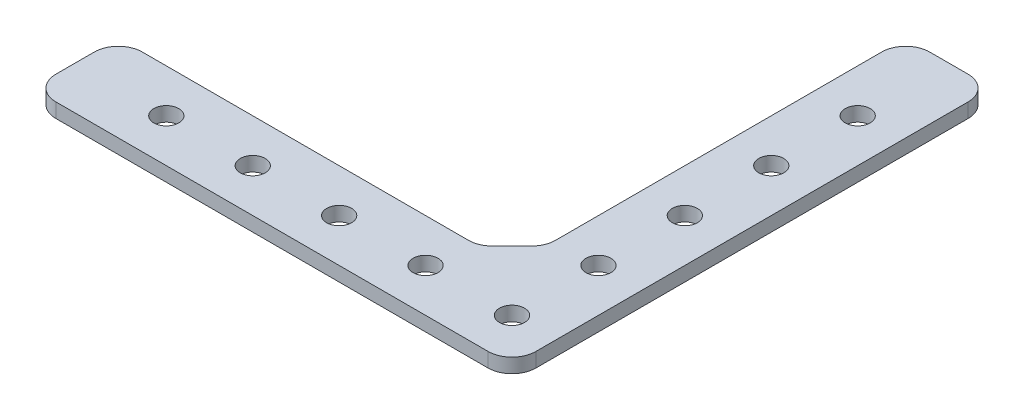
ISO-10303-21;
HEADER;
FILE_DESCRIPTION(('STEP AP214'),'2;1');
FILE_NAME('part.step','',(''),(''),'','','');
FILE_SCHEMA(('AUTOMOTIVE_DESIGN { 1 0 10303 214 1 1 1 1 }'));
ENDSEC;
DATA;
#1=APPLICATION_CONTEXT('core data for automotive mechanical design processes');
#2=APPLICATION_PROTOCOL_DEFINITION('international standard','automotive_design',2000,#1);
#3=PRODUCT_CONTEXT('',#1,'mechanical');
#4=PRODUCT('Part','Part','',(#3));
#5=PRODUCT_RELATED_PRODUCT_CATEGORY('part','',(#4));
#6=PRODUCT_DEFINITION_FORMATION('','',#4);
#7=PRODUCT_DEFINITION_CONTEXT('part definition',#1,'design');
#8=PRODUCT_DEFINITION('design','',#6,#7);
#9=PRODUCT_DEFINITION_SHAPE('','',#8);
#10=(LENGTH_UNIT() NAMED_UNIT(*) SI_UNIT(.MILLI.,.METRE.));
#11=(NAMED_UNIT(*) PLANE_ANGLE_UNIT() SI_UNIT($,.RADIAN.));
#12=(NAMED_UNIT(*) SI_UNIT($,.STERADIAN.) SOLID_ANGLE_UNIT());
#13=UNCERTAINTY_MEASURE_WITH_UNIT(LENGTH_MEASURE(1.E-05),#10,'distance_accuracy_value','');
#14=(GEOMETRIC_REPRESENTATION_CONTEXT(3) GLOBAL_UNCERTAINTY_ASSIGNED_CONTEXT((#13)) GLOBAL_UNIT_ASSIGNED_CONTEXT((#10,
#11,#12)) REPRESENTATION_CONTEXT('',''));
#15=CARTESIAN_POINT('',(0.,0.,0.));
#16=DIRECTION('',(0.,0.,1.));
#17=DIRECTION('',(1.,0.,0.));
#18=AXIS2_PLACEMENT_3D('',#15,#16,#17);
#19=CARTESIAN_POINT('',(50.,-3.,-50.));
#20=DIRECTION('',(1.,0.,0.));
#21=DIRECTION('',(0.,0.,-1.));
#22=AXIS2_PLACEMENT_3D('',#19,#20,#21);
#23=PLANE('',#22);
#24=DIRECTION('',(0.,0.,-1.));
#25=VECTOR('',#24,1.);
#26=CARTESIAN_POINT('',(50.,-3.,-50.));
#27=LINE('',#26,#25);
#28=CARTESIAN_POINT('',(50.,-3.,45.));
#29=VERTEX_POINT('',#28);
#30=CARTESIAN_POINT('',(50.,-3.,-45.));
#31=VERTEX_POINT('',#30);
#32=EDGE_CURVE('E243',#29,#31,#27,.T.);
#33=ORIENTED_EDGE('',*,*,#32,.T.);
#34=DIRECTION('',(0.,1.,0.));
#35=VECTOR('',#34,1.);
#36=CARTESIAN_POINT('',(50.,-3.,-45.));
#37=LINE('',#36,#35);
#38=CARTESIAN_POINT('',(50.,0.,-45.));
#39=VERTEX_POINT('',#38);
#40=EDGE_CURVE('E222',#31,#39,#37,.T.);
#41=ORIENTED_EDGE('',*,*,#40,.T.);
#42=DIRECTION('',(0.,0.,-1.));
#43=VECTOR('',#42,1.);
#44=CARTESIAN_POINT('',(50.,0.,-50.));
#45=LINE('',#44,#43);
#46=CARTESIAN_POINT('',(50.,0.,45.));
#47=VERTEX_POINT('',#46);
#48=EDGE_CURVE('E248',#47,#39,#45,.T.);
#49=ORIENTED_EDGE('',*,*,#48,.F.);
#50=DIRECTION('',(0.,1.,0.));
#51=VECTOR('',#50,1.);
#52=CARTESIAN_POINT('',(50.,-3.,45.));
#53=LINE('',#52,#51);
#54=EDGE_CURVE('E220',#47,#29,#53,.F.);
#55=ORIENTED_EDGE('',*,*,#54,.T.);
#56=EDGE_LOOP('',(#33,#41,#49,#55));
#57=FACE_BOUND('',#56,.T.);
#58=ADVANCED_FACE('F39',(#57),#23,.T.);
#59=CARTESIAN_POINT('',(-50.,-3.,50.));
#60=DIRECTION('',(0.,0.,1.));
#61=DIRECTION('',(1.,0.,0.));
#62=AXIS2_PLACEMENT_3D('',#59,#60,#61);
#63=PLANE('',#62);
#64=DIRECTION('',(1.,0.,0.));
#65=VECTOR('',#64,1.);
#66=CARTESIAN_POINT('',(-50.,-3.,50.));
#67=LINE('',#66,#65);
#68=CARTESIAN_POINT('',(-45.,-3.,50.));
#69=VERTEX_POINT('',#68);
#70=CARTESIAN_POINT('',(45.,-3.,50.));
#71=VERTEX_POINT('',#70);
#72=EDGE_CURVE('E170',#69,#71,#67,.T.);
#73=ORIENTED_EDGE('',*,*,#72,.T.);
#74=DIRECTION('',(0.,1.,0.));
#75=VECTOR('',#74,1.);
#76=CARTESIAN_POINT('',(45.,-3.,50.));
#77=LINE('',#76,#75);
#78=CARTESIAN_POINT('',(45.,0.,50.));
#79=VERTEX_POINT('',#78);
#80=EDGE_CURVE('E11',#71,#79,#77,.T.);
#81=ORIENTED_EDGE('',*,*,#80,.T.);
#82=DIRECTION('',(1.,0.,0.));
#83=VECTOR('',#82,1.);
#84=CARTESIAN_POINT('',(-50.,0.,50.));
#85=LINE('',#84,#83);
#86=CARTESIAN_POINT('',(-45.,0.,50.));
#87=VERTEX_POINT('',#86);
#88=EDGE_CURVE('E178',#87,#79,#85,.T.);
#89=ORIENTED_EDGE('',*,*,#88,.F.);
#90=DIRECTION('',(0.,1.,0.));
#91=VECTOR('',#90,1.);
#92=CARTESIAN_POINT('',(-45.,-3.,50.));
#93=LINE('',#92,#91);
#94=EDGE_CURVE('E47',#87,#69,#93,.F.);
#95=ORIENTED_EDGE('',*,*,#94,.T.);
#96=EDGE_LOOP('',(#73,#81,#89,#95));
#97=FACE_BOUND('',#96,.T.);
#98=ADVANCED_FACE('F227',(#97),#63,.T.);
#99=CARTESIAN_POINT('',(-49.9999999999999,-3.,32.));
#100=DIRECTION('',(-1.,0.,0.));
#101=DIRECTION('',(0.,0.,1.));
#102=AXIS2_PLACEMENT_3D('',#99,#100,#101);
#103=PLANE('',#102);
#104=DIRECTION('',(0.,0.,1.));
#105=VECTOR('',#104,1.);
#106=CARTESIAN_POINT('',(-49.9999999999999,0.,32.));
#107=LINE('',#106,#105);
#108=CARTESIAN_POINT('',(-49.9999999999999,0.,37.));
#109=VERTEX_POINT('',#108);
#110=CARTESIAN_POINT('',(-50.,0.,45.));
#111=VERTEX_POINT('',#110);
#112=EDGE_CURVE('E239',#109,#111,#107,.T.);
#113=ORIENTED_EDGE('',*,*,#112,.F.);
#114=DIRECTION('',(0.,1.,0.));
#115=VECTOR('',#114,1.);
#116=CARTESIAN_POINT('',(-49.9999999999999,-3.,37.));
#117=LINE('',#116,#115);
#118=CARTESIAN_POINT('',(-49.9999999999999,-3.,37.));
#119=VERTEX_POINT('',#118);
#120=EDGE_CURVE('E218',#109,#119,#117,.F.);
#121=ORIENTED_EDGE('',*,*,#120,.T.);
#122=DIRECTION('',(0.,0.,1.));
#123=VECTOR('',#122,1.);
#124=CARTESIAN_POINT('',(-49.9999999999999,-3.,32.));
#125=LINE('',#124,#123);
#126=CARTESIAN_POINT('',(-50.,-3.,45.));
#127=VERTEX_POINT('',#126);
#128=EDGE_CURVE('E175',#119,#127,#125,.T.);
#129=ORIENTED_EDGE('',*,*,#128,.T.);
#130=DIRECTION('',(0.,1.,0.));
#131=VECTOR('',#130,1.);
#132=CARTESIAN_POINT('',(-50.,-3.,45.));
#133=LINE('',#132,#131);
#134=EDGE_CURVE('E215',#127,#111,#133,.T.);
#135=ORIENTED_EDGE('',*,*,#134,.T.);
#136=EDGE_LOOP('',(#113,#121,#129,#135));
#137=FACE_BOUND('',#136,.T.);
#138=ADVANCED_FACE('F238',(#137),#103,.T.);
#139=CARTESIAN_POINT('',(24.9999999999999,-3.,32.));
#140=DIRECTION('',(0.,0.,-1.));
#141=DIRECTION('',(-1.,0.,0.));
#142=AXIS2_PLACEMENT_3D('',#139,#140,#141);
#143=PLANE('',#142);
#144=DIRECTION('',(-1.,0.,0.));
#145=VECTOR('',#144,1.);
#146=CARTESIAN_POINT('',(24.9999999999999,-3.,32.));
#147=LINE('',#146,#145);
#148=CARTESIAN_POINT('',(22.9289321881343,-3.,32.));
#149=VERTEX_POINT('',#148);
#150=CARTESIAN_POINT('',(-44.9999999999999,-3.,32.));
#151=VERTEX_POINT('',#150);
#152=EDGE_CURVE('E253',#149,#151,#147,.T.);
#153=ORIENTED_EDGE('',*,*,#152,.T.);
#154=DIRECTION('',(0.,1.,0.));
#155=VECTOR('',#154,1.);
#156=CARTESIAN_POINT('',(-44.9999999999999,-3.,32.));
#157=LINE('',#156,#155);
#158=CARTESIAN_POINT('',(-44.9999999999999,0.,32.));
#159=VERTEX_POINT('',#158);
#160=EDGE_CURVE('E212',#151,#159,#157,.T.);
#161=ORIENTED_EDGE('',*,*,#160,.T.);
#162=DIRECTION('',(-1.,0.,0.));
#163=VECTOR('',#162,1.);
#164=CARTESIAN_POINT('',(24.9999999999999,0.,32.));
#165=LINE('',#164,#163);
#166=CARTESIAN_POINT('',(22.9289321881343,0.,32.));
#167=VERTEX_POINT('',#166);
#168=EDGE_CURVE('E242',#167,#159,#165,.T.);
#169=ORIENTED_EDGE('',*,*,#168,.F.);
#170=DIRECTION('',(0.,1.,0.));
#171=VECTOR('',#170,1.);
#172=CARTESIAN_POINT('',(22.9289321881343,-3.,32.));
#173=LINE('',#172,#171);
#174=EDGE_CURVE('E163',#167,#149,#173,.F.);
#175=ORIENTED_EDGE('',*,*,#174,.T.);
#176=EDGE_LOOP('',(#153,#161,#169,#175));
#177=FACE_BOUND('',#176,.T.);
#178=ADVANCED_FACE('F411',(#177),#143,.T.);
#179=CARTESIAN_POINT('',(31.9999999999998,-3.,24.9999999999997));
#180=DIRECTION('',(-0.707106781186566,0.,-0.707106781186529));
#181=DIRECTION('',(-0.707106781186529,0.,0.707106781186566));
#182=AXIS2_PLACEMENT_3D('',#179,#180,#181);
#183=PLANE('',#182);
#184=DIRECTION('',(-0.707106781186529,0.,0.707106781186566));
#185=VECTOR('',#184,1.);
#186=CARTESIAN_POINT('',(31.9999999999998,0.,24.9999999999997));
#187=LINE('',#186,#185);
#188=CARTESIAN_POINT('',(30.5355339059326,0.,26.464466094067));
#189=VERTEX_POINT('',#188);
#190=CARTESIAN_POINT('',(26.4644660940671,0.,30.5355339059327));
#191=VERTEX_POINT('',#190);
#192=EDGE_CURVE('E152',#189,#191,#187,.T.);
#193=ORIENTED_EDGE('',*,*,#192,.F.);
#194=DIRECTION('',(0.,1.,0.));
#195=VECTOR('',#194,1.);
#196=CARTESIAN_POINT('',(30.5355339059326,-3.,26.464466094067));
#197=LINE('',#196,#195);
#198=CARTESIAN_POINT('',(30.5355339059326,-3.,26.464466094067));
#199=VERTEX_POINT('',#198);
#200=EDGE_CURVE('E161',#189,#199,#197,.F.);
#201=ORIENTED_EDGE('',*,*,#200,.T.);
#202=DIRECTION('',(-0.707106781186529,0.,0.707106781186566));
#203=VECTOR('',#202,1.);
#204=CARTESIAN_POINT('',(31.9999999999998,-3.,24.9999999999997));
#205=LINE('',#204,#203);
#206=CARTESIAN_POINT('',(26.4644660940671,-3.,30.5355339059327));
#207=VERTEX_POINT('',#206);
#208=EDGE_CURVE('E255',#199,#207,#205,.T.);
#209=ORIENTED_EDGE('',*,*,#208,.T.);
#210=DIRECTION('',(0.,1.,0.));
#211=VECTOR('',#210,1.);
#212=CARTESIAN_POINT('',(26.4644660940671,0.,30.5355339059327));
#213=LINE('',#212,#211);
#214=EDGE_CURVE('E169',#207,#191,#213,.T.);
#215=ORIENTED_EDGE('',*,*,#214,.T.);
#216=EDGE_LOOP('',(#193,#201,#209,#215));
#217=FACE_BOUND('',#216,.T.);
#218=ADVANCED_FACE('F407',(#217),#183,.T.);
#219=CARTESIAN_POINT('',(32.,-3.,-50.));
#220=DIRECTION('',(-1.,0.,0.));
#221=DIRECTION('',(0.,0.,1.));
#222=AXIS2_PLACEMENT_3D('',#219,#220,#221);
#223=PLANE('',#222);
#224=DIRECTION('',(0.,0.,1.));
#225=VECTOR('',#224,1.);
#226=CARTESIAN_POINT('',(32.,0.,-50.));
#227=LINE('',#226,#225);
#228=CARTESIAN_POINT('',(32.,0.,-45.));
#229=VERTEX_POINT('',#228);
#230=CARTESIAN_POINT('',(31.9999999999998,0.,22.9289321881344));
#231=VERTEX_POINT('',#230);
#232=EDGE_CURVE('E141',#229,#231,#227,.T.);
#233=ORIENTED_EDGE('',*,*,#232,.F.);
#234=DIRECTION('',(0.,1.,0.));
#235=VECTOR('',#234,1.);
#236=CARTESIAN_POINT('',(32.,-3.,-45.));
#237=LINE('',#236,#235);
#238=CARTESIAN_POINT('',(32.,-3.,-45.));
#239=VERTEX_POINT('',#238);
#240=EDGE_CURVE('E202',#229,#239,#237,.F.);
#241=ORIENTED_EDGE('',*,*,#240,.T.);
#242=DIRECTION('',(0.,0.,1.));
#243=VECTOR('',#242,1.);
#244=CARTESIAN_POINT('',(32.,-3.,-50.));
#245=LINE('',#244,#243);
#246=CARTESIAN_POINT('',(31.9999999999998,-3.,22.9289321881344));
#247=VERTEX_POINT('',#246);
#248=EDGE_CURVE('E167',#239,#247,#245,.T.);
#249=ORIENTED_EDGE('',*,*,#248,.T.);
#250=DIRECTION('',(0.,1.,0.));
#251=VECTOR('',#250,1.);
#252=CARTESIAN_POINT('',(31.9999999999998,0.,22.9289321881344));
#253=LINE('',#252,#251);
#254=EDGE_CURVE('E160',#247,#231,#253,.T.);
#255=ORIENTED_EDGE('',*,*,#254,.T.);
#256=EDGE_LOOP('',(#233,#241,#249,#255));
#257=FACE_BOUND('',#256,.T.);
#258=ADVANCED_FACE('F165',(#257),#223,.T.);
#259=CARTESIAN_POINT('',(32.,-3.,-50.));
#260=DIRECTION('',(0.,0.,-1.));
#261=DIRECTION('',(-1.,0.,0.));
#262=AXIS2_PLACEMENT_3D('',#259,#260,#261);
#263=PLANE('',#262);
#264=DIRECTION('',(-1.,0.,0.));
#265=VECTOR('',#264,1.);
#266=CARTESIAN_POINT('',(32.,-3.,-50.));
#267=LINE('',#266,#265);
#268=CARTESIAN_POINT('',(45.,-3.,-50.));
#269=VERTEX_POINT('',#268);
#270=CARTESIAN_POINT('',(37.,-3.,-50.));
#271=VERTEX_POINT('',#270);
#272=EDGE_CURVE('E259',#269,#271,#267,.T.);
#273=ORIENTED_EDGE('',*,*,#272,.T.);
#274=DIRECTION('',(0.,1.,0.));
#275=VECTOR('',#274,1.);
#276=CARTESIAN_POINT('',(37.,-3.,-50.));
#277=LINE('',#276,#275);
#278=CARTESIAN_POINT('',(37.,0.,-50.));
#279=VERTEX_POINT('',#278);
#280=EDGE_CURVE('E190',#271,#279,#277,.T.);
#281=ORIENTED_EDGE('',*,*,#280,.T.);
#282=DIRECTION('',(-1.,0.,0.));
#283=VECTOR('',#282,1.);
#284=CARTESIAN_POINT('',(32.,0.,-50.));
#285=LINE('',#284,#283);
#286=CARTESIAN_POINT('',(45.,0.,-50.));
#287=VERTEX_POINT('',#286);
#288=EDGE_CURVE('E153',#287,#279,#285,.T.);
#289=ORIENTED_EDGE('',*,*,#288,.F.);
#290=DIRECTION('',(0.,1.,0.));
#291=VECTOR('',#290,1.);
#292=CARTESIAN_POINT('',(45.,-3.,-50.));
#293=LINE('',#292,#291);
#294=EDGE_CURVE('E188',#287,#269,#293,.F.);
#295=ORIENTED_EDGE('',*,*,#294,.T.);
#296=EDGE_LOOP('',(#273,#281,#289,#295));
#297=FACE_BOUND('',#296,.T.);
#298=ADVANCED_FACE('F368',(#297),#263,.T.);
#299=CARTESIAN_POINT('',(0.,-3.,0.));
#300=DIRECTION('',(0.,1.,0.));
#301=DIRECTION('',(0.,0.,1.));
#302=AXIS2_PLACEMENT_3D('',#299,#300,#301);
#303=PLANE('',#302);
#304=CARTESIAN_POINT('',(40.9999999999998,-3.,-31.));
#305=DIRECTION('',(0.,1.,0.));
#306=DIRECTION('',(0.,0.,1.));
#307=AXIS2_PLACEMENT_3D('',#304,#305,#306);
#308=CIRCLE('',#307,2.6);
#309=CARTESIAN_POINT('',(40.9999999999998,-3.,-28.4));
#310=VERTEX_POINT('',#309);
#311=EDGE_CURVE('E309',#310,#310,#308,.T.);
#312=ORIENTED_EDGE('',*,*,#311,.T.);
#313=EDGE_LOOP('',(#312));
#314=FACE_BOUND('',#313,.T.);
#315=CARTESIAN_POINT('',(40.9999999999998,-3.,-13.));
#316=DIRECTION('',(0.,1.,0.));
#317=DIRECTION('',(0.,0.,1.));
#318=AXIS2_PLACEMENT_3D('',#315,#316,#317);
#319=CIRCLE('',#318,2.6);
#320=CARTESIAN_POINT('',(40.9999999999998,-3.,-10.4));
#321=VERTEX_POINT('',#320);
#322=EDGE_CURVE('E303',#321,#321,#319,.T.);
#323=ORIENTED_EDGE('',*,*,#322,.T.);
#324=EDGE_LOOP('',(#323));
#325=FACE_BOUND('',#324,.T.);
#326=CARTESIAN_POINT('',(40.9999999999999,-3.,5.));
#327=DIRECTION('',(0.,1.,0.));
#328=DIRECTION('',(0.,0.,1.));
#329=AXIS2_PLACEMENT_3D('',#326,#327,#328);
#330=CIRCLE('',#329,2.6);
#331=CARTESIAN_POINT('',(40.9999999999999,-3.,7.59999999999999));
#332=VERTEX_POINT('',#331);
#333=EDGE_CURVE('E297',#332,#332,#330,.T.);
#334=ORIENTED_EDGE('',*,*,#333,.T.);
#335=EDGE_LOOP('',(#334));
#336=FACE_BOUND('',#335,.T.);
#337=CARTESIAN_POINT('',(40.9999999999999,-3.,23.));
#338=DIRECTION('',(0.,1.,0.));
#339=DIRECTION('',(0.,0.,1.));
#340=AXIS2_PLACEMENT_3D('',#337,#338,#339);
#341=CIRCLE('',#340,2.6);
#342=CARTESIAN_POINT('',(40.9999999999999,-3.,25.6));
#343=VERTEX_POINT('',#342);
#344=EDGE_CURVE('E291',#343,#343,#341,.T.);
#345=ORIENTED_EDGE('',*,*,#344,.T.);
#346=EDGE_LOOP('',(#345));
#347=FACE_BOUND('',#346,.T.);
#348=CARTESIAN_POINT('',(-31.,-3.,41.0000000000005));
#349=DIRECTION('',(0.,1.,0.));
#350=DIRECTION('',(0.,0.,1.));
#351=AXIS2_PLACEMENT_3D('',#348,#349,#350);
#352=CIRCLE('',#351,2.6);
#353=CARTESIAN_POINT('',(-31.,-3.,43.6000000000005));
#354=VERTEX_POINT('',#353);
#355=EDGE_CURVE('E285',#354,#354,#352,.T.);
#356=ORIENTED_EDGE('',*,*,#355,.T.);
#357=EDGE_LOOP('',(#356));
#358=FACE_BOUND('',#357,.T.);
#359=CARTESIAN_POINT('',(-13.,-3.,41.0000000000004));
#360=DIRECTION('',(0.,1.,0.));
#361=DIRECTION('',(0.,0.,1.));
#362=AXIS2_PLACEMENT_3D('',#359,#360,#361);
#363=CIRCLE('',#362,2.6);
#364=CARTESIAN_POINT('',(-13.,-3.,43.6000000000004));
#365=VERTEX_POINT('',#364);
#366=EDGE_CURVE('E279',#365,#365,#363,.T.);
#367=ORIENTED_EDGE('',*,*,#366,.T.);
#368=EDGE_LOOP('',(#367));
#369=FACE_BOUND('',#368,.T.);
#370=CARTESIAN_POINT('',(5.00000000000001,-3.,41.0000000000002));
#371=DIRECTION('',(0.,1.,0.));
#372=DIRECTION('',(0.,0.,1.));
#373=AXIS2_PLACEMENT_3D('',#370,#371,#372);
#374=CIRCLE('',#373,2.6);
#375=CARTESIAN_POINT('',(5.00000000000001,-3.,43.6000000000002));
#376=VERTEX_POINT('',#375);
#377=EDGE_CURVE('E273',#376,#376,#374,.T.);
#378=ORIENTED_EDGE('',*,*,#377,.T.);
#379=EDGE_LOOP('',(#378));
#380=FACE_BOUND('',#379,.T.);
#381=CARTESIAN_POINT('',(23.,-3.,41.0000000000001));
#382=DIRECTION('',(0.,1.,0.));
#383=DIRECTION('',(0.,0.,1.));
#384=AXIS2_PLACEMENT_3D('',#381,#382,#383);
#385=CIRCLE('',#384,2.6);
#386=CARTESIAN_POINT('',(23.,-3.,43.6000000000001));
#387=VERTEX_POINT('',#386);
#388=EDGE_CURVE('E267',#387,#387,#385,.T.);
#389=ORIENTED_EDGE('',*,*,#388,.T.);
#390=EDGE_LOOP('',(#389));
#391=FACE_BOUND('',#390,.T.);
#392=CARTESIAN_POINT('',(41.,-3.,41.));
#393=DIRECTION('',(0.,1.,0.));
#394=DIRECTION('',(0.,0.,1.));
#395=AXIS2_PLACEMENT_3D('',#392,#393,#394);
#396=CIRCLE('',#395,2.6);
#397=CARTESIAN_POINT('',(41.,-3.,43.6));
#398=VERTEX_POINT('',#397);
#399=EDGE_CURVE('E250',#398,#398,#396,.T.);
#400=ORIENTED_EDGE('',*,*,#399,.T.);
#401=EDGE_LOOP('',(#400));
#402=FACE_BOUND('',#401,.T.);
#403=ORIENTED_EDGE('',*,*,#248,.F.);
#404=CARTESIAN_POINT('',(37.,-3.,-45.));
#405=DIRECTION('',(0.,1.,0.));
#406=DIRECTION('',(0.,0.,1.));
#407=AXIS2_PLACEMENT_3D('',#404,#405,#406);
#408=CIRCLE('',#407,5.);
#409=EDGE_CURVE('E210',#239,#271,#408,.F.);
#410=ORIENTED_EDGE('',*,*,#409,.T.);
#411=ORIENTED_EDGE('',*,*,#272,.F.);
#412=CARTESIAN_POINT('',(45.,-3.,-45.));
#413=DIRECTION('',(0.,1.,0.));
#414=DIRECTION('',(0.,0.,1.));
#415=AXIS2_PLACEMENT_3D('',#412,#413,#414);
#416=CIRCLE('',#415,5.);
#417=EDGE_CURVE('E207',#269,#31,#416,.F.);
#418=ORIENTED_EDGE('',*,*,#417,.T.);
#419=ORIENTED_EDGE('',*,*,#32,.F.);
#420=CARTESIAN_POINT('',(45.,-3.,45.));
#421=DIRECTION('',(0.,1.,0.));
#422=DIRECTION('',(0.,0.,1.));
#423=AXIS2_PLACEMENT_3D('',#420,#421,#422);
#424=CIRCLE('',#423,5.);
#425=EDGE_CURVE('E205',#29,#71,#424,.F.);
#426=ORIENTED_EDGE('',*,*,#425,.T.);
#427=ORIENTED_EDGE('',*,*,#72,.F.);
#428=CARTESIAN_POINT('',(-45.,-3.,45.));
#429=DIRECTION('',(0.,1.,0.));
#430=DIRECTION('',(0.,0.,1.));
#431=AXIS2_PLACEMENT_3D('',#428,#429,#430);
#432=CIRCLE('',#431,5.);
#433=EDGE_CURVE('E60',#69,#127,#432,.F.);
#434=ORIENTED_EDGE('',*,*,#433,.T.);
#435=ORIENTED_EDGE('',*,*,#128,.F.);
#436=CARTESIAN_POINT('',(-44.9999999999999,-3.,37.));
#437=DIRECTION('',(0.,1.,0.));
#438=DIRECTION('',(0.,0.,1.));
#439=AXIS2_PLACEMENT_3D('',#436,#437,#438);
#440=CIRCLE('',#439,5.);
#441=EDGE_CURVE('E54',#119,#151,#440,.F.);
#442=ORIENTED_EDGE('',*,*,#441,.T.);
#443=ORIENTED_EDGE('',*,*,#152,.F.);
#444=CARTESIAN_POINT('',(22.9289321881343,-3.,27.));
#445=DIRECTION('',(0.,1.,0.));
#446=DIRECTION('',(0.,0.,1.));
#447=AXIS2_PLACEMENT_3D('',#444,#445,#446);
#448=CIRCLE('',#447,5.);
#449=EDGE_CURVE('E186',#149,#207,#448,.T.);
#450=ORIENTED_EDGE('',*,*,#449,.T.);
#451=ORIENTED_EDGE('',*,*,#208,.F.);
#452=CARTESIAN_POINT('',(26.9999999999998,-3.,22.9289321881344));
#453=DIRECTION('',(0.,1.,0.));
#454=DIRECTION('',(0.,0.,1.));
#455=AXIS2_PLACEMENT_3D('',#452,#453,#454);
#456=CIRCLE('',#455,5.);
#457=EDGE_CURVE('E162',#199,#247,#456,.T.);
#458=ORIENTED_EDGE('',*,*,#457,.T.);
#459=EDGE_LOOP('',(#403,#410,#411,#418,#419,#426,#427,#434,#435,#442,#443,#450,#451,#458));
#460=FACE_BOUND('',#459,.T.);
#461=ADVANCED_FACE('F231',(#314,#325,#336,#347,#358,#369,#380,#391,#402,#460),#303,.F.);
#462=CARTESIAN_POINT('',(0.,0.,0.));
#463=DIRECTION('',(0.,1.,0.));
#464=DIRECTION('',(0.,0.,1.));
#465=AXIS2_PLACEMENT_3D('',#462,#463,#464);
#466=PLANE('',#465);
#467=CARTESIAN_POINT('',(40.9999999999998,0.,-31.));
#468=DIRECTION('',(0.,1.,0.));
#469=DIRECTION('',(0.,0.,1.));
#470=AXIS2_PLACEMENT_3D('',#467,#468,#469);
#471=CIRCLE('',#470,2.6);
#472=CARTESIAN_POINT('',(40.9999999999998,0.,-28.4));
#473=VERTEX_POINT('',#472);
#474=EDGE_CURVE('E312',#473,#473,#471,.T.);
#475=ORIENTED_EDGE('',*,*,#474,.F.);
#476=EDGE_LOOP('',(#475));
#477=FACE_BOUND('',#476,.T.);
#478=CARTESIAN_POINT('',(40.9999999999998,0.,-13.));
#479=DIRECTION('',(0.,1.,0.));
#480=DIRECTION('',(0.,0.,1.));
#481=AXIS2_PLACEMENT_3D('',#478,#479,#480);
#482=CIRCLE('',#481,2.6);
#483=CARTESIAN_POINT('',(40.9999999999998,0.,-10.4));
#484=VERTEX_POINT('',#483);
#485=EDGE_CURVE('E306',#484,#484,#482,.T.);
#486=ORIENTED_EDGE('',*,*,#485,.F.);
#487=EDGE_LOOP('',(#486));
#488=FACE_BOUND('',#487,.T.);
#489=CARTESIAN_POINT('',(40.9999999999999,0.,5.));
#490=DIRECTION('',(0.,1.,0.));
#491=DIRECTION('',(0.,0.,1.));
#492=AXIS2_PLACEMENT_3D('',#489,#490,#491);
#493=CIRCLE('',#492,2.6);
#494=CARTESIAN_POINT('',(40.9999999999999,0.,7.59999999999999));
#495=VERTEX_POINT('',#494);
#496=EDGE_CURVE('E300',#495,#495,#493,.T.);
#497=ORIENTED_EDGE('',*,*,#496,.F.);
#498=EDGE_LOOP('',(#497));
#499=FACE_BOUND('',#498,.T.);
#500=CARTESIAN_POINT('',(40.9999999999999,0.,23.));
#501=DIRECTION('',(0.,1.,0.));
#502=DIRECTION('',(0.,0.,1.));
#503=AXIS2_PLACEMENT_3D('',#500,#501,#502);
#504=CIRCLE('',#503,2.6);
#505=CARTESIAN_POINT('',(40.9999999999999,0.,25.6));
#506=VERTEX_POINT('',#505);
#507=EDGE_CURVE('E294',#506,#506,#504,.T.);
#508=ORIENTED_EDGE('',*,*,#507,.F.);
#509=EDGE_LOOP('',(#508));
#510=FACE_BOUND('',#509,.T.);
#511=CARTESIAN_POINT('',(-31.,0.,41.0000000000005));
#512=DIRECTION('',(0.,1.,0.));
#513=DIRECTION('',(0.,0.,1.));
#514=AXIS2_PLACEMENT_3D('',#511,#512,#513);
#515=CIRCLE('',#514,2.6);
#516=CARTESIAN_POINT('',(-31.,0.,43.6000000000005));
#517=VERTEX_POINT('',#516);
#518=EDGE_CURVE('E288',#517,#517,#515,.T.);
#519=ORIENTED_EDGE('',*,*,#518,.F.);
#520=EDGE_LOOP('',(#519));
#521=FACE_BOUND('',#520,.T.);
#522=CARTESIAN_POINT('',(-13.,0.,41.0000000000004));
#523=DIRECTION('',(0.,1.,0.));
#524=DIRECTION('',(0.,0.,1.));
#525=AXIS2_PLACEMENT_3D('',#522,#523,#524);
#526=CIRCLE('',#525,2.6);
#527=CARTESIAN_POINT('',(-13.,0.,43.6000000000004));
#528=VERTEX_POINT('',#527);
#529=EDGE_CURVE('E282',#528,#528,#526,.T.);
#530=ORIENTED_EDGE('',*,*,#529,.F.);
#531=EDGE_LOOP('',(#530));
#532=FACE_BOUND('',#531,.T.);
#533=CARTESIAN_POINT('',(5.00000000000001,0.,41.0000000000002));
#534=DIRECTION('',(0.,1.,0.));
#535=DIRECTION('',(0.,0.,1.));
#536=AXIS2_PLACEMENT_3D('',#533,#534,#535);
#537=CIRCLE('',#536,2.6);
#538=CARTESIAN_POINT('',(5.00000000000001,0.,43.6000000000002));
#539=VERTEX_POINT('',#538);
#540=EDGE_CURVE('E276',#539,#539,#537,.T.);
#541=ORIENTED_EDGE('',*,*,#540,.F.);
#542=EDGE_LOOP('',(#541));
#543=FACE_BOUND('',#542,.T.);
#544=CARTESIAN_POINT('',(23.,0.,41.0000000000001));
#545=DIRECTION('',(0.,1.,0.));
#546=DIRECTION('',(0.,0.,1.));
#547=AXIS2_PLACEMENT_3D('',#544,#545,#546);
#548=CIRCLE('',#547,2.6);
#549=CARTESIAN_POINT('',(23.,0.,43.6000000000001));
#550=VERTEX_POINT('',#549);
#551=EDGE_CURVE('E270',#550,#550,#548,.T.);
#552=ORIENTED_EDGE('',*,*,#551,.F.);
#553=EDGE_LOOP('',(#552));
#554=FACE_BOUND('',#553,.T.);
#555=CARTESIAN_POINT('',(41.,0.,41.));
#556=DIRECTION('',(0.,1.,0.));
#557=DIRECTION('',(0.,0.,1.));
#558=AXIS2_PLACEMENT_3D('',#555,#556,#557);
#559=CIRCLE('',#558,2.6);
#560=CARTESIAN_POINT('',(41.,0.,43.6));
#561=VERTEX_POINT('',#560);
#562=EDGE_CURVE('E264',#561,#561,#559,.T.);
#563=ORIENTED_EDGE('',*,*,#562,.F.);
#564=EDGE_LOOP('',(#563));
#565=FACE_BOUND('',#564,.T.);
#566=ORIENTED_EDGE('',*,*,#288,.T.);
#567=CARTESIAN_POINT('',(37.,0.,-45.));
#568=DIRECTION('',(0.,1.,0.));
#569=DIRECTION('',(0.,0.,1.));
#570=AXIS2_PLACEMENT_3D('',#567,#568,#569);
#571=CIRCLE('',#570,5.);
#572=EDGE_CURVE('E148',#279,#229,#571,.T.);
#573=ORIENTED_EDGE('',*,*,#572,.T.);
#574=ORIENTED_EDGE('',*,*,#232,.T.);
#575=CARTESIAN_POINT('',(26.9999999999998,0.,22.9289321881344));
#576=DIRECTION('',(0.,1.,0.));
#577=DIRECTION('',(0.,0.,1.));
#578=AXIS2_PLACEMENT_3D('',#575,#576,#577);
#579=CIRCLE('',#578,5.);
#580=EDGE_CURVE('E146',#231,#189,#579,.F.);
#581=ORIENTED_EDGE('',*,*,#580,.T.);
#582=ORIENTED_EDGE('',*,*,#192,.T.);
#583=CARTESIAN_POINT('',(22.9289321881343,0.,27.));
#584=DIRECTION('',(0.,1.,0.));
#585=DIRECTION('',(0.,0.,1.));
#586=AXIS2_PLACEMENT_3D('',#583,#584,#585);
#587=CIRCLE('',#586,5.);
#588=EDGE_CURVE('E184',#191,#167,#587,.F.);
#589=ORIENTED_EDGE('',*,*,#588,.T.);
#590=ORIENTED_EDGE('',*,*,#168,.T.);
#591=CARTESIAN_POINT('',(-44.9999999999999,0.,37.));
#592=DIRECTION('',(0.,1.,0.));
#593=DIRECTION('',(0.,0.,1.));
#594=AXIS2_PLACEMENT_3D('',#591,#592,#593);
#595=CIRCLE('',#594,5.);
#596=EDGE_CURVE('E199',#159,#109,#595,.T.);
#597=ORIENTED_EDGE('',*,*,#596,.T.);
#598=ORIENTED_EDGE('',*,*,#112,.T.);
#599=CARTESIAN_POINT('',(-45.,0.,45.));
#600=DIRECTION('',(0.,1.,0.));
#601=DIRECTION('',(0.,0.,1.));
#602=AXIS2_PLACEMENT_3D('',#599,#600,#601);
#603=CIRCLE('',#602,5.);
#604=EDGE_CURVE('E193',#111,#87,#603,.T.);
#605=ORIENTED_EDGE('',*,*,#604,.T.);
#606=ORIENTED_EDGE('',*,*,#88,.T.);
#607=CARTESIAN_POINT('',(45.,0.,45.));
#608=DIRECTION('',(0.,1.,0.));
#609=DIRECTION('',(0.,0.,1.));
#610=AXIS2_PLACEMENT_3D('',#607,#608,#609);
#611=CIRCLE('',#610,5.);
#612=EDGE_CURVE('E195',#79,#47,#611,.T.);
#613=ORIENTED_EDGE('',*,*,#612,.T.);
#614=ORIENTED_EDGE('',*,*,#48,.T.);
#615=CARTESIAN_POINT('',(45.,0.,-45.));
#616=DIRECTION('',(0.,1.,0.));
#617=DIRECTION('',(0.,0.,1.));
#618=AXIS2_PLACEMENT_3D('',#615,#616,#617);
#619=CIRCLE('',#618,5.);
#620=EDGE_CURVE('E197',#39,#287,#619,.T.);
#621=ORIENTED_EDGE('',*,*,#620,.T.);
#622=EDGE_LOOP('',(#566,#573,#574,#581,#582,#589,#590,#597,#598,#605,#606,#613,#614,#621));
#623=FACE_BOUND('',#622,.T.);
#624=ADVANCED_FACE('F144',(#477,#488,#499,#510,#521,#532,#543,#554,#565,#623),#466,.T.);
#625=CARTESIAN_POINT('',(41.,-3.,41.));
#626=DIRECTION('',(0.,1.,0.));
#627=DIRECTION('',(0.,0.,1.));
#628=AXIS2_PLACEMENT_3D('',#625,#626,#627);
#629=CYLINDRICAL_SURFACE('',#628,2.6);
#630=ORIENTED_EDGE('',*,*,#399,.F.);
#631=EDGE_LOOP('',(#630));
#632=FACE_BOUND('',#631,.T.);
#633=ORIENTED_EDGE('',*,*,#562,.T.);
#634=EDGE_LOOP('',(#633));
#635=FACE_BOUND('',#634,.T.);
#636=ADVANCED_FACE('F329',(#632,#635),#629,.F.);
#637=CARTESIAN_POINT('',(23.,-3.,41.0000000000001));
#638=DIRECTION('',(0.,1.,0.));
#639=DIRECTION('',(0.,0.,1.));
#640=AXIS2_PLACEMENT_3D('',#637,#638,#639);
#641=CYLINDRICAL_SURFACE('',#640,2.6);
#642=ORIENTED_EDGE('',*,*,#388,.F.);
#643=EDGE_LOOP('',(#642));
#644=FACE_BOUND('',#643,.T.);
#645=ORIENTED_EDGE('',*,*,#551,.T.);
#646=EDGE_LOOP('',(#645));
#647=FACE_BOUND('',#646,.T.);
#648=ADVANCED_FACE('F348',(#644,#647),#641,.F.);
#649=CARTESIAN_POINT('',(5.00000000000001,-3.,41.0000000000002));
#650=DIRECTION('',(0.,1.,0.));
#651=DIRECTION('',(0.,0.,1.));
#652=AXIS2_PLACEMENT_3D('',#649,#650,#651);
#653=CYLINDRICAL_SURFACE('',#652,2.6);
#654=ORIENTED_EDGE('',*,*,#377,.F.);
#655=EDGE_LOOP('',(#654));
#656=FACE_BOUND('',#655,.T.);
#657=ORIENTED_EDGE('',*,*,#540,.T.);
#658=EDGE_LOOP('',(#657));
#659=FACE_BOUND('',#658,.T.);
#660=ADVANCED_FACE('F354',(#656,#659),#653,.F.);
#661=CARTESIAN_POINT('',(-13.,-3.,41.0000000000004));
#662=DIRECTION('',(0.,1.,0.));
#663=DIRECTION('',(0.,0.,1.));
#664=AXIS2_PLACEMENT_3D('',#661,#662,#663);
#665=CYLINDRICAL_SURFACE('',#664,2.6);
#666=ORIENTED_EDGE('',*,*,#366,.F.);
#667=EDGE_LOOP('',(#666));
#668=FACE_BOUND('',#667,.T.);
#669=ORIENTED_EDGE('',*,*,#529,.T.);
#670=EDGE_LOOP('',(#669));
#671=FACE_BOUND('',#670,.T.);
#672=ADVANCED_FACE('F509',(#668,#671),#665,.F.);
#673=CARTESIAN_POINT('',(-31.,-3.,41.0000000000005));
#674=DIRECTION('',(0.,1.,0.));
#675=DIRECTION('',(0.,0.,1.));
#676=AXIS2_PLACEMENT_3D('',#673,#674,#675);
#677=CYLINDRICAL_SURFACE('',#676,2.6);
#678=ORIENTED_EDGE('',*,*,#355,.F.);
#679=EDGE_LOOP('',(#678));
#680=FACE_BOUND('',#679,.T.);
#681=ORIENTED_EDGE('',*,*,#518,.T.);
#682=EDGE_LOOP('',(#681));
#683=FACE_BOUND('',#682,.T.);
#684=ADVANCED_FACE('F501',(#680,#683),#677,.F.);
#685=CARTESIAN_POINT('',(40.9999999999999,-3.,23.));
#686=DIRECTION('',(0.,1.,0.));
#687=DIRECTION('',(0.,0.,1.));
#688=AXIS2_PLACEMENT_3D('',#685,#686,#687);
#689=CYLINDRICAL_SURFACE('',#688,2.6);
#690=ORIENTED_EDGE('',*,*,#344,.F.);
#691=EDGE_LOOP('',(#690));
#692=FACE_BOUND('',#691,.T.);
#693=ORIENTED_EDGE('',*,*,#507,.T.);
#694=EDGE_LOOP('',(#693));
#695=FACE_BOUND('',#694,.T.);
#696=ADVANCED_FACE('F493',(#692,#695),#689,.F.);
#697=CARTESIAN_POINT('',(40.9999999999999,-3.,5.));
#698=DIRECTION('',(0.,1.,0.));
#699=DIRECTION('',(0.,0.,1.));
#700=AXIS2_PLACEMENT_3D('',#697,#698,#699);
#701=CYLINDRICAL_SURFACE('',#700,2.6);
#702=ORIENTED_EDGE('',*,*,#333,.F.);
#703=EDGE_LOOP('',(#702));
#704=FACE_BOUND('',#703,.T.);
#705=ORIENTED_EDGE('',*,*,#496,.T.);
#706=EDGE_LOOP('',(#705));
#707=FACE_BOUND('',#706,.T.);
#708=ADVANCED_FACE('F485',(#704,#707),#701,.F.);
#709=CARTESIAN_POINT('',(40.9999999999998,-3.,-13.));
#710=DIRECTION('',(0.,1.,0.));
#711=DIRECTION('',(0.,0.,1.));
#712=AXIS2_PLACEMENT_3D('',#709,#710,#711);
#713=CYLINDRICAL_SURFACE('',#712,2.6);
#714=ORIENTED_EDGE('',*,*,#322,.F.);
#715=EDGE_LOOP('',(#714));
#716=FACE_BOUND('',#715,.T.);
#717=ORIENTED_EDGE('',*,*,#485,.T.);
#718=EDGE_LOOP('',(#717));
#719=FACE_BOUND('',#718,.T.);
#720=ADVANCED_FACE('F323',(#716,#719),#713,.F.);
#721=CARTESIAN_POINT('',(40.9999999999998,-3.,-31.));
#722=DIRECTION('',(0.,1.,0.));
#723=DIRECTION('',(0.,0.,1.));
#724=AXIS2_PLACEMENT_3D('',#721,#722,#723);
#725=CYLINDRICAL_SURFACE('',#724,2.6);
#726=ORIENTED_EDGE('',*,*,#311,.F.);
#727=EDGE_LOOP('',(#726));
#728=FACE_BOUND('',#727,.T.);
#729=ORIENTED_EDGE('',*,*,#474,.T.);
#730=EDGE_LOOP('',(#729));
#731=FACE_BOUND('',#730,.T.);
#732=ADVANCED_FACE('F320',(#728,#731),#725,.F.);
#733=CARTESIAN_POINT('',(26.9999999999998,-3.,22.9289321881344));
#734=DIRECTION('',(0.,-1.,0.));
#735=DIRECTION('',(0.,0.,-1.));
#736=AXIS2_PLACEMENT_3D('',#733,#734,#735);
#737=CYLINDRICAL_SURFACE('',#736,5.);
#738=ORIENTED_EDGE('',*,*,#457,.F.);
#739=ORIENTED_EDGE('',*,*,#200,.F.);
#740=ORIENTED_EDGE('',*,*,#580,.F.);
#741=ORIENTED_EDGE('',*,*,#254,.F.);
#742=EDGE_LOOP('',(#738,#739,#740,#741));
#743=FACE_BOUND('',#742,.T.);
#744=ADVANCED_FACE('F159',(#743),#737,.F.);
#745=CARTESIAN_POINT('',(22.9289321881343,-3.,27.));
#746=DIRECTION('',(0.,-1.,0.));
#747=DIRECTION('',(0.,0.,-1.));
#748=AXIS2_PLACEMENT_3D('',#745,#746,#747);
#749=CYLINDRICAL_SURFACE('',#748,5.);
#750=ORIENTED_EDGE('',*,*,#449,.F.);
#751=ORIENTED_EDGE('',*,*,#174,.F.);
#752=ORIENTED_EDGE('',*,*,#588,.F.);
#753=ORIENTED_EDGE('',*,*,#214,.F.);
#754=EDGE_LOOP('',(#750,#751,#752,#753));
#755=FACE_BOUND('',#754,.T.);
#756=ADVANCED_FACE('F372',(#755),#749,.F.);
#757=CARTESIAN_POINT('',(37.,-3.,-45.));
#758=DIRECTION('',(0.,1.,0.));
#759=DIRECTION('',(0.,0.,1.));
#760=AXIS2_PLACEMENT_3D('',#757,#758,#759);
#761=CYLINDRICAL_SURFACE('',#760,5.);
#762=ORIENTED_EDGE('',*,*,#409,.F.);
#763=ORIENTED_EDGE('',*,*,#240,.F.);
#764=ORIENTED_EDGE('',*,*,#572,.F.);
#765=ORIENTED_EDGE('',*,*,#280,.F.);
#766=EDGE_LOOP('',(#762,#763,#764,#765));
#767=FACE_BOUND('',#766,.T.);
#768=ADVANCED_FACE('F375',(#767),#761,.T.);
#769=CARTESIAN_POINT('',(-44.9999999999999,-3.,37.));
#770=DIRECTION('',(0.,1.,0.));
#771=DIRECTION('',(0.,0.,1.));
#772=AXIS2_PLACEMENT_3D('',#769,#770,#771);
#773=CYLINDRICAL_SURFACE('',#772,5.);
#774=ORIENTED_EDGE('',*,*,#441,.F.);
#775=ORIENTED_EDGE('',*,*,#120,.F.);
#776=ORIENTED_EDGE('',*,*,#596,.F.);
#777=ORIENTED_EDGE('',*,*,#160,.F.);
#778=EDGE_LOOP('',(#774,#775,#776,#777));
#779=FACE_BOUND('',#778,.T.);
#780=ADVANCED_FACE('F379',(#779),#773,.T.);
#781=CARTESIAN_POINT('',(45.,-3.,-45.));
#782=DIRECTION('',(0.,1.,0.));
#783=DIRECTION('',(0.,0.,1.));
#784=AXIS2_PLACEMENT_3D('',#781,#782,#783);
#785=CYLINDRICAL_SURFACE('',#784,5.);
#786=ORIENTED_EDGE('',*,*,#417,.F.);
#787=ORIENTED_EDGE('',*,*,#294,.F.);
#788=ORIENTED_EDGE('',*,*,#620,.F.);
#789=ORIENTED_EDGE('',*,*,#40,.F.);
#790=EDGE_LOOP('',(#786,#787,#788,#789));
#791=FACE_BOUND('',#790,.T.);
#792=ADVANCED_FACE('F383',(#791),#785,.T.);
#793=CARTESIAN_POINT('',(45.,-3.,45.));
#794=DIRECTION('',(0.,1.,0.));
#795=DIRECTION('',(0.,0.,1.));
#796=AXIS2_PLACEMENT_3D('',#793,#794,#795);
#797=CYLINDRICAL_SURFACE('',#796,5.);
#798=ORIENTED_EDGE('',*,*,#425,.F.);
#799=ORIENTED_EDGE('',*,*,#54,.F.);
#800=ORIENTED_EDGE('',*,*,#612,.F.);
#801=ORIENTED_EDGE('',*,*,#80,.F.);
#802=EDGE_LOOP('',(#798,#799,#800,#801));
#803=FACE_BOUND('',#802,.T.);
#804=ADVANCED_FACE('F386',(#803),#797,.T.);
#805=CARTESIAN_POINT('',(-45.,-3.,45.));
#806=DIRECTION('',(0.,1.,0.));
#807=DIRECTION('',(0.,0.,1.));
#808=AXIS2_PLACEMENT_3D('',#805,#806,#807);
#809=CYLINDRICAL_SURFACE('',#808,5.);
#810=ORIENTED_EDGE('',*,*,#433,.F.);
#811=ORIENTED_EDGE('',*,*,#94,.F.);
#812=ORIENTED_EDGE('',*,*,#604,.F.);
#813=ORIENTED_EDGE('',*,*,#134,.F.);
#814=EDGE_LOOP('',(#810,#811,#812,#813));
#815=FACE_BOUND('',#814,.T.);
#816=ADVANCED_FACE('F41',(#815),#809,.T.);
#817=CLOSED_SHELL('',(#58,#98,#138,#178,#218,#258,#298,#461,#624,#636,#648,#660,#672,#684,#696,
#708,#720,#732,#744,#756,#768,#780,#792,#804,#816));
#818=MANIFOLD_SOLID_BREP('B2',#817);
#819=ADVANCED_BREP_SHAPE_REPRESENTATION('',(#18,#818),#14);
#820=SHAPE_DEFINITION_REPRESENTATION(#9,#819);
ENDSEC;
END-ISO-10303-21;
